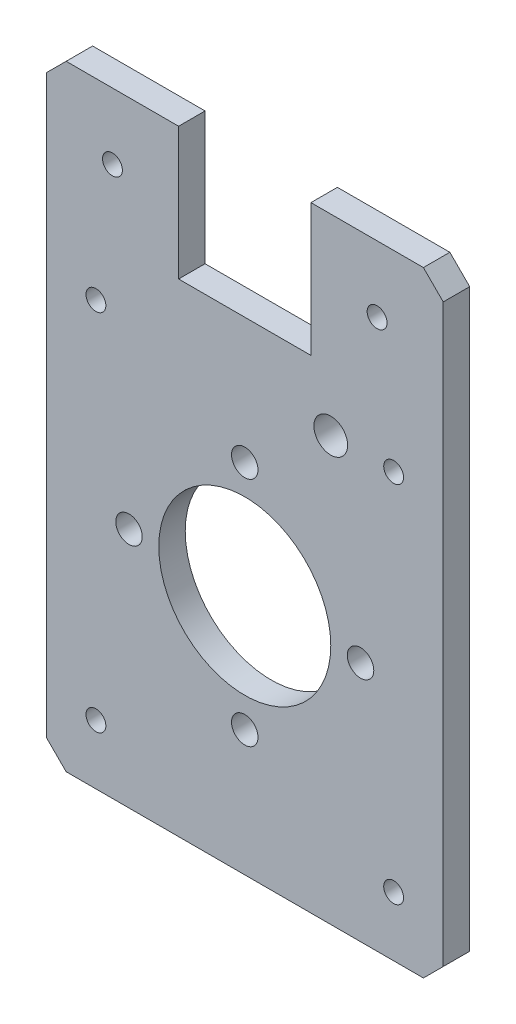
ISO-10303-21;
HEADER;
FILE_DESCRIPTION(('STEP AP214'),'2;1');
FILE_NAME('part.step','',(''),(''),'','','');
FILE_SCHEMA(('AUTOMOTIVE_DESIGN { 1 0 10303 214 1 1 1 1 }'));
ENDSEC;
DATA;
#1=APPLICATION_CONTEXT('core data for automotive mechanical design processes');
#2=APPLICATION_PROTOCOL_DEFINITION('international standard','automotive_design',2000,#1);
#3=PRODUCT_CONTEXT('',#1,'mechanical');
#4=PRODUCT('Part','Part','',(#3));
#5=PRODUCT_RELATED_PRODUCT_CATEGORY('part','',(#4));
#6=PRODUCT_DEFINITION_FORMATION('','',#4);
#7=PRODUCT_DEFINITION_CONTEXT('part definition',#1,'design');
#8=PRODUCT_DEFINITION('design','',#6,#7);
#9=PRODUCT_DEFINITION_SHAPE('','',#8);
#10=(LENGTH_UNIT() NAMED_UNIT(*) SI_UNIT(.MILLI.,.METRE.));
#11=(NAMED_UNIT(*) PLANE_ANGLE_UNIT() SI_UNIT($,.RADIAN.));
#12=(NAMED_UNIT(*) SI_UNIT($,.STERADIAN.) SOLID_ANGLE_UNIT());
#13=UNCERTAINTY_MEASURE_WITH_UNIT(LENGTH_MEASURE(1.E-05),#10,'distance_accuracy_value','');
#14=(GEOMETRIC_REPRESENTATION_CONTEXT(3) GLOBAL_UNCERTAINTY_ASSIGNED_CONTEXT((#13)) GLOBAL_UNIT_ASSIGNED_CONTEXT((#10,
#11,#12)) REPRESENTATION_CONTEXT('',''));
#15=CARTESIAN_POINT('',(0.,0.,0.));
#16=DIRECTION('',(0.,0.,1.));
#17=DIRECTION('',(1.,0.,0.));
#18=AXIS2_PLACEMENT_3D('',#15,#16,#17);
#19=CARTESIAN_POINT('',(0.,0.,6.));
#20=DIRECTION('',(1.,0.,0.));
#21=DIRECTION('',(0.,0.,-1.));
#22=AXIS2_PLACEMENT_3D('',#19,#20,#21);
#23=PLANE('',#22);
#24=DIRECTION('',(0.,-1.,0.));
#25=VECTOR('',#24,1.);
#26=CARTESIAN_POINT('',(0.,90.,4.));
#27=LINE('',#26,#25);
#28=CARTESIAN_POINT('',(0.,90.,4.));
#29=VERTEX_POINT('',#28);
#30=CARTESIAN_POINT('',(0.,3.00000000000003,4.));
#31=VERTEX_POINT('',#30);
#32=EDGE_CURVE('E173',#29,#31,#27,.T.);
#33=ORIENTED_EDGE('',*,*,#32,.F.);
#34=DIRECTION('',(0.,0.,-1.));
#35=VECTOR('',#34,1.);
#36=CARTESIAN_POINT('',(0.,90.,0.));
#37=LINE('',#36,#35);
#38=CARTESIAN_POINT('',(0.,90.,0.));
#39=VERTEX_POINT('',#38);
#40=EDGE_CURVE('E47',#29,#39,#37,.T.);
#41=ORIENTED_EDGE('',*,*,#40,.T.);
#42=DIRECTION('',(0.,-1.,0.));
#43=VECTOR('',#42,1.);
#44=CARTESIAN_POINT('',(0.,0.,0.));
#45=LINE('',#44,#43);
#46=CARTESIAN_POINT('',(0.,3.00000000000003,0.));
#47=VERTEX_POINT('',#46);
#48=EDGE_CURVE('E171',#39,#47,#45,.T.);
#49=ORIENTED_EDGE('',*,*,#48,.T.);
#50=DIRECTION('',(0.,0.,1.));
#51=VECTOR('',#50,1.);
#52=CARTESIAN_POINT('',(0.,3.00000000000003,6.));
#53=LINE('',#52,#51);
#54=EDGE_CURVE('E154',#47,#31,#53,.T.);
#55=ORIENTED_EDGE('',*,*,#54,.T.);
#56=EDGE_LOOP('',(#33,#41,#49,#55));
#57=FACE_BOUND('',#56,.T.);
#58=ADVANCED_FACE('F38',(#57),#23,.F.);
#59=CARTESIAN_POINT('',(0.,0.,6.));
#60=DIRECTION('',(0.,1.,0.));
#61=DIRECTION('',(0.,0.,1.));
#62=AXIS2_PLACEMENT_3D('',#59,#60,#61);
#63=PLANE('',#62);
#64=DIRECTION('',(1.,0.,0.));
#65=VECTOR('',#64,1.);
#66=CARTESIAN_POINT('',(3.00000000000002,0.,4.));
#67=LINE('',#66,#65);
#68=CARTESIAN_POINT('',(3.00000000000002,0.,4.));
#69=VERTEX_POINT('',#68);
#70=CARTESIAN_POINT('',(57.,0.,4.));
#71=VERTEX_POINT('',#70);
#72=EDGE_CURVE('E135',#69,#71,#67,.T.);
#73=ORIENTED_EDGE('',*,*,#72,.F.);
#74=DIRECTION('',(0.,0.,-1.));
#75=VECTOR('',#74,1.);
#76=CARTESIAN_POINT('',(3.00000000000002,0.,6.));
#77=LINE('',#76,#75);
#78=CARTESIAN_POINT('',(3.00000000000002,0.,0.));
#79=VERTEX_POINT('',#78);
#80=EDGE_CURVE('E200',#69,#79,#77,.T.);
#81=ORIENTED_EDGE('',*,*,#80,.T.);
#82=DIRECTION('',(1.,0.,0.));
#83=VECTOR('',#82,1.);
#84=CARTESIAN_POINT('',(0.,0.,0.));
#85=LINE('',#84,#83);
#86=CARTESIAN_POINT('',(57.,0.,0.));
#87=VERTEX_POINT('',#86);
#88=EDGE_CURVE('E183',#79,#87,#85,.T.);
#89=ORIENTED_EDGE('',*,*,#88,.T.);
#90=DIRECTION('',(0.,0.,1.));
#91=VECTOR('',#90,1.);
#92=CARTESIAN_POINT('',(57.,0.,6.));
#93=LINE('',#92,#91);
#94=EDGE_CURVE('E198',#87,#71,#93,.T.);
#95=ORIENTED_EDGE('',*,*,#94,.T.);
#96=EDGE_LOOP('',(#73,#81,#89,#95));
#97=FACE_BOUND('',#96,.T.);
#98=ADVANCED_FACE('F203',(#97),#63,.F.);
#99=CARTESIAN_POINT('',(60.,0.,6.));
#100=DIRECTION('',(-1.,0.,0.));
#101=DIRECTION('',(0.,-1.,0.));
#102=AXIS2_PLACEMENT_3D('',#99,#100,#101);
#103=PLANE('',#102);
#104=DIRECTION('',(0.,1.,0.));
#105=VECTOR('',#104,1.);
#106=CARTESIAN_POINT('',(60.,3.00000000000002,4.));
#107=LINE('',#106,#105);
#108=CARTESIAN_POINT('',(60.,3.00000000000002,4.));
#109=VERTEX_POINT('',#108);
#110=CARTESIAN_POINT('',(60.,90.,4.));
#111=VERTEX_POINT('',#110);
#112=EDGE_CURVE('E132',#109,#111,#107,.T.);
#113=ORIENTED_EDGE('',*,*,#112,.F.);
#114=DIRECTION('',(0.,0.,-1.));
#115=VECTOR('',#114,1.);
#116=CARTESIAN_POINT('',(60.,3.00000000000002,6.));
#117=LINE('',#116,#115);
#118=CARTESIAN_POINT('',(60.,3.00000000000002,0.));
#119=VERTEX_POINT('',#118);
#120=EDGE_CURVE('E145',#109,#119,#117,.T.);
#121=ORIENTED_EDGE('',*,*,#120,.T.);
#122=DIRECTION('',(0.,1.,0.));
#123=VECTOR('',#122,1.);
#124=CARTESIAN_POINT('',(60.,0.,0.));
#125=LINE('',#124,#123);
#126=CARTESIAN_POINT('',(60.,90.,0.));
#127=VERTEX_POINT('',#126);
#128=EDGE_CURVE('E187',#119,#127,#125,.T.);
#129=ORIENTED_EDGE('',*,*,#128,.T.);
#130=DIRECTION('',(0.,0.,1.));
#131=VECTOR('',#130,1.);
#132=CARTESIAN_POINT('',(60.,90.,6.));
#133=LINE('',#132,#131);
#134=EDGE_CURVE('E148',#127,#111,#133,.T.);
#135=ORIENTED_EDGE('',*,*,#134,.T.);
#136=EDGE_LOOP('',(#113,#121,#129,#135));
#137=FACE_BOUND('',#136,.T.);
#138=ADVANCED_FACE('F144',(#137),#103,.F.);
#139=CARTESIAN_POINT('',(0.,73.,6.));
#140=DIRECTION('',(0.,-1.,0.));
#141=DIRECTION('',(0.,0.,-1.));
#142=AXIS2_PLACEMENT_3D('',#139,#140,#141);
#143=PLANE('',#142);
#144=DIRECTION('',(-1.,0.,0.));
#145=VECTOR('',#144,1.);
#146=CARTESIAN_POINT('',(40.,73.,4.));
#147=LINE('',#146,#145);
#148=CARTESIAN_POINT('',(40.,73.,4.));
#149=VERTEX_POINT('',#148);
#150=CARTESIAN_POINT('',(20.,73.,4.));
#151=VERTEX_POINT('',#150);
#152=EDGE_CURVE('E354',#149,#151,#147,.T.);
#153=ORIENTED_EDGE('',*,*,#152,.F.);
#154=DIRECTION('',(0.,0.,-1.));
#155=VECTOR('',#154,1.);
#156=CARTESIAN_POINT('',(40.,73.,6.));
#157=LINE('',#156,#155);
#158=CARTESIAN_POINT('',(40.,73.,0.));
#159=VERTEX_POINT('',#158);
#160=EDGE_CURVE('E280',#149,#159,#157,.T.);
#161=ORIENTED_EDGE('',*,*,#160,.T.);
#162=DIRECTION('',(-1.,0.,0.));
#163=VECTOR('',#162,1.);
#164=CARTESIAN_POINT('',(0.,73.,0.));
#165=LINE('',#164,#163);
#166=CARTESIAN_POINT('',(20.,73.,0.));
#167=VERTEX_POINT('',#166);
#168=EDGE_CURVE('E195',#159,#167,#165,.T.);
#169=ORIENTED_EDGE('',*,*,#168,.T.);
#170=DIRECTION('',(0.,0.,-1.));
#171=VECTOR('',#170,1.);
#172=CARTESIAN_POINT('',(20.,73.,6.));
#173=LINE('',#172,#171);
#174=EDGE_CURVE('E272',#151,#167,#173,.T.);
#175=ORIENTED_EDGE('',*,*,#174,.F.);
#176=EDGE_LOOP('',(#153,#161,#169,#175));
#177=FACE_BOUND('',#176,.T.);
#178=ADVANCED_FACE('F310',(#177),#143,.F.);
#179=CARTESIAN_POINT('',(7.5,64.,6.));
#180=DIRECTION('',(0.,0.,-1.));
#181=DIRECTION('',(-1.,0.,0.));
#182=AXIS2_PLACEMENT_3D('',#179,#180,#181);
#183=CYLINDRICAL_SURFACE('',#182,1.5);
#184=CARTESIAN_POINT('',(7.5,64.,0.));
#185=DIRECTION('',(0.,0.,-1.));
#186=DIRECTION('',(-1.,0.,0.));
#187=AXIS2_PLACEMENT_3D('',#184,#185,#186);
#188=CIRCLE('',#187,1.5);
#189=CARTESIAN_POINT('',(6.,64.,0.));
#190=VERTEX_POINT('',#189);
#191=EDGE_CURVE('E184',#190,#190,#188,.T.);
#192=ORIENTED_EDGE('',*,*,#191,.T.);
#193=EDGE_LOOP('',(#192));
#194=FACE_BOUND('',#193,.T.);
#195=CARTESIAN_POINT('',(7.5,64.,4.));
#196=DIRECTION('',(0.,0.,1.));
#197=DIRECTION('',(1.,0.,0.));
#198=AXIS2_PLACEMENT_3D('',#195,#196,#197);
#199=CIRCLE('',#198,1.5);
#200=CARTESIAN_POINT('',(9.,64.,4.));
#201=VERTEX_POINT('',#200);
#202=EDGE_CURVE('E242',#201,#201,#199,.F.);
#203=ORIENTED_EDGE('',*,*,#202,.F.);
#204=EDGE_LOOP('',(#203));
#205=FACE_BOUND('',#204,.T.);
#206=ADVANCED_FACE('F306',(#194,#205),#183,.F.);
#207=CARTESIAN_POINT('',(52.5,9.,6.));
#208=DIRECTION('',(0.,0.,-1.));
#209=DIRECTION('',(-1.,0.,0.));
#210=AXIS2_PLACEMENT_3D('',#207,#208,#209);
#211=CYLINDRICAL_SURFACE('',#210,1.5);
#212=CARTESIAN_POINT('',(52.5,9.,0.));
#213=DIRECTION('',(0.,0.,-1.));
#214=DIRECTION('',(-1.,0.,0.));
#215=AXIS2_PLACEMENT_3D('',#212,#213,#214);
#216=CIRCLE('',#215,1.5);
#217=CARTESIAN_POINT('',(51.,9.,0.));
#218=VERTEX_POINT('',#217);
#219=EDGE_CURVE('E190',#218,#218,#216,.T.);
#220=ORIENTED_EDGE('',*,*,#219,.T.);
#221=EDGE_LOOP('',(#220));
#222=FACE_BOUND('',#221,.T.);
#223=CARTESIAN_POINT('',(52.5,9.,4.));
#224=DIRECTION('',(0.,0.,1.));
#225=DIRECTION('',(1.,0.,0.));
#226=AXIS2_PLACEMENT_3D('',#223,#224,#225);
#227=CIRCLE('',#226,1.5);
#228=CARTESIAN_POINT('',(54.,9.,4.));
#229=VERTEX_POINT('',#228);
#230=EDGE_CURVE('E239',#229,#229,#227,.F.);
#231=ORIENTED_EDGE('',*,*,#230,.F.);
#232=EDGE_LOOP('',(#231));
#233=FACE_BOUND('',#232,.T.);
#234=ADVANCED_FACE('F309',(#222,#233),#211,.F.);
#235=CARTESIAN_POINT('',(7.49999999999999,9.,6.));
#236=DIRECTION('',(0.,0.,-1.));
#237=DIRECTION('',(-1.,0.,0.));
#238=AXIS2_PLACEMENT_3D('',#235,#236,#237);
#239=CYLINDRICAL_SURFACE('',#238,1.5);
#240=CARTESIAN_POINT('',(7.49999999999999,9.,0.));
#241=DIRECTION('',(0.,0.,-1.));
#242=DIRECTION('',(-1.,0.,0.));
#243=AXIS2_PLACEMENT_3D('',#240,#241,#242);
#244=CIRCLE('',#243,1.5);
#245=CARTESIAN_POINT('',(5.99999999999999,9.,0.));
#246=VERTEX_POINT('',#245);
#247=EDGE_CURVE('E287',#246,#246,#244,.T.);
#248=ORIENTED_EDGE('',*,*,#247,.T.);
#249=EDGE_LOOP('',(#248));
#250=FACE_BOUND('',#249,.T.);
#251=CARTESIAN_POINT('',(7.49999999999999,9.,4.));
#252=DIRECTION('',(0.,0.,1.));
#253=DIRECTION('',(1.,0.,0.));
#254=AXIS2_PLACEMENT_3D('',#251,#252,#253);
#255=CIRCLE('',#254,1.5);
#256=CARTESIAN_POINT('',(8.99999999999999,9.,4.));
#257=VERTEX_POINT('',#256);
#258=EDGE_CURVE('E236',#257,#257,#255,.F.);
#259=ORIENTED_EDGE('',*,*,#258,.F.);
#260=EDGE_LOOP('',(#259));
#261=FACE_BOUND('',#260,.T.);
#262=ADVANCED_FACE('F388',(#250,#261),#239,.F.);
#263=CARTESIAN_POINT('',(52.5,64.,6.));
#264=DIRECTION('',(0.,0.,-1.));
#265=DIRECTION('',(-1.,0.,0.));
#266=AXIS2_PLACEMENT_3D('',#263,#264,#265);
#267=CYLINDRICAL_SURFACE('',#266,1.5);
#268=CARTESIAN_POINT('',(52.5,64.,0.));
#269=DIRECTION('',(0.,0.,-1.));
#270=DIRECTION('',(-1.,0.,0.));
#271=AXIS2_PLACEMENT_3D('',#268,#269,#270);
#272=CIRCLE('',#271,1.5);
#273=CARTESIAN_POINT('',(51.,64.,0.));
#274=VERTEX_POINT('',#273);
#275=EDGE_CURVE('E283',#274,#274,#272,.T.);
#276=ORIENTED_EDGE('',*,*,#275,.T.);
#277=EDGE_LOOP('',(#276));
#278=FACE_BOUND('',#277,.T.);
#279=CARTESIAN_POINT('',(52.5,64.,4.));
#280=DIRECTION('',(0.,0.,1.));
#281=DIRECTION('',(1.,0.,0.));
#282=AXIS2_PLACEMENT_3D('',#279,#280,#281);
#283=CIRCLE('',#282,1.5);
#284=CARTESIAN_POINT('',(54.,64.,4.));
#285=VERTEX_POINT('',#284);
#286=EDGE_CURVE('E233',#285,#285,#283,.F.);
#287=ORIENTED_EDGE('',*,*,#286,.F.);
#288=EDGE_LOOP('',(#287));
#289=FACE_BOUND('',#288,.T.);
#290=ADVANCED_FACE('F292',(#278,#289),#267,.F.);
#291=CARTESIAN_POINT('',(0.,93.,6.));
#292=DIRECTION('',(0.,1.,0.));
#293=DIRECTION('',(0.,0.,1.));
#294=AXIS2_PLACEMENT_3D('',#291,#292,#293);
#295=PLANE('',#294);
#296=DIRECTION('',(0.,0.,-1.));
#297=VECTOR('',#296,1.);
#298=CARTESIAN_POINT('',(40.,93.,6.));
#299=LINE('',#298,#297);
#300=CARTESIAN_POINT('',(40.,93.,4.));
#301=VERTEX_POINT('',#300);
#302=CARTESIAN_POINT('',(40.,93.,0.));
#303=VERTEX_POINT('',#302);
#304=EDGE_CURVE('E281',#301,#303,#299,.T.);
#305=ORIENTED_EDGE('',*,*,#304,.F.);
#306=DIRECTION('',(-1.,0.,0.));
#307=VECTOR('',#306,1.);
#308=CARTESIAN_POINT('',(57.,93.,4.));
#309=LINE('',#308,#307);
#310=CARTESIAN_POINT('',(57.,93.,4.));
#311=VERTEX_POINT('',#310);
#312=EDGE_CURVE('E350',#311,#301,#309,.T.);
#313=ORIENTED_EDGE('',*,*,#312,.F.);
#314=DIRECTION('',(0.,0.,-1.));
#315=VECTOR('',#314,1.);
#316=CARTESIAN_POINT('',(57.,93.,0.));
#317=LINE('',#316,#315);
#318=CARTESIAN_POINT('',(57.,93.,0.));
#319=VERTEX_POINT('',#318);
#320=EDGE_CURVE('E153',#311,#319,#317,.T.);
#321=ORIENTED_EDGE('',*,*,#320,.T.);
#322=DIRECTION('',(1.,0.,0.));
#323=VECTOR('',#322,1.);
#324=CARTESIAN_POINT('',(0.,93.,0.));
#325=LINE('',#324,#323);
#326=EDGE_CURVE('E274',#303,#319,#325,.T.);
#327=ORIENTED_EDGE('',*,*,#326,.F.);
#328=EDGE_LOOP('',(#305,#313,#321,#327));
#329=FACE_BOUND('',#328,.T.);
#330=ADVANCED_FACE('F349',(#329),#295,.T.);
#331=CARTESIAN_POINT('',(40.,0.,6.));
#332=DIRECTION('',(-1.,0.,0.));
#333=DIRECTION('',(0.,0.,1.));
#334=AXIS2_PLACEMENT_3D('',#331,#332,#333);
#335=PLANE('',#334);
#336=ORIENTED_EDGE('',*,*,#160,.F.);
#337=DIRECTION('',(0.,-1.,0.));
#338=VECTOR('',#337,1.);
#339=CARTESIAN_POINT('',(40.,93.,4.));
#340=LINE('',#339,#338);
#341=EDGE_CURVE('E352',#301,#149,#340,.T.);
#342=ORIENTED_EDGE('',*,*,#341,.F.);
#343=ORIENTED_EDGE('',*,*,#304,.T.);
#344=DIRECTION('',(0.,1.,0.));
#345=VECTOR('',#344,1.);
#346=CARTESIAN_POINT('',(40.,0.,0.));
#347=LINE('',#346,#345);
#348=EDGE_CURVE('E277',#159,#303,#347,.T.);
#349=ORIENTED_EDGE('',*,*,#348,.F.);
#350=EDGE_LOOP('',(#336,#342,#343,#349));
#351=FACE_BOUND('',#350,.T.);
#352=ADVANCED_FACE('F375',(#351),#335,.T.);
#353=CARTESIAN_POINT('',(0.,93.,6.));
#354=DIRECTION('',(0.,1.,0.));
#355=DIRECTION('',(0.,0.,1.));
#356=AXIS2_PLACEMENT_3D('',#353,#354,#355);
#357=PLANE('',#356);
#358=DIRECTION('',(0.,0.,1.));
#359=VECTOR('',#358,1.);
#360=CARTESIAN_POINT('',(3.00000000000002,93.,6.));
#361=LINE('',#360,#359);
#362=CARTESIAN_POINT('',(3.00000000000002,93.,0.));
#363=VERTEX_POINT('',#362);
#364=CARTESIAN_POINT('',(3.00000000000002,93.,4.));
#365=VERTEX_POINT('',#364);
#366=EDGE_CURVE('E11',#363,#365,#361,.T.);
#367=ORIENTED_EDGE('',*,*,#366,.T.);
#368=DIRECTION('',(-1.,0.,0.));
#369=VECTOR('',#368,1.);
#370=CARTESIAN_POINT('',(20.,93.,4.));
#371=LINE('',#370,#369);
#372=CARTESIAN_POINT('',(20.,93.,4.));
#373=VERTEX_POINT('',#372);
#374=EDGE_CURVE('E54',#373,#365,#371,.T.);
#375=ORIENTED_EDGE('',*,*,#374,.F.);
#376=DIRECTION('',(0.,0.,-1.));
#377=VECTOR('',#376,1.);
#378=CARTESIAN_POINT('',(20.,93.,6.));
#379=LINE('',#378,#377);
#380=CARTESIAN_POINT('',(20.,93.,0.));
#381=VERTEX_POINT('',#380);
#382=EDGE_CURVE('E271',#373,#381,#379,.T.);
#383=ORIENTED_EDGE('',*,*,#382,.T.);
#384=DIRECTION('',(1.,0.,0.));
#385=VECTOR('',#384,1.);
#386=CARTESIAN_POINT('',(0.,93.,0.));
#387=LINE('',#386,#385);
#388=EDGE_CURVE('E264',#363,#381,#387,.T.);
#389=ORIENTED_EDGE('',*,*,#388,.F.);
#390=EDGE_LOOP('',(#367,#375,#383,#389));
#391=FACE_BOUND('',#390,.T.);
#392=ADVANCED_FACE('F362',(#391),#357,.T.);
#393=CARTESIAN_POINT('',(20.,0.,6.));
#394=DIRECTION('',(1.,0.,0.));
#395=DIRECTION('',(0.,1.,0.));
#396=AXIS2_PLACEMENT_3D('',#393,#394,#395);
#397=PLANE('',#396);
#398=ORIENTED_EDGE('',*,*,#382,.F.);
#399=DIRECTION('',(0.,1.,0.));
#400=VECTOR('',#399,1.);
#401=CARTESIAN_POINT('',(20.,73.,4.));
#402=LINE('',#401,#400);
#403=EDGE_CURVE('E359',#151,#373,#402,.T.);
#404=ORIENTED_EDGE('',*,*,#403,.F.);
#405=ORIENTED_EDGE('',*,*,#174,.T.);
#406=DIRECTION('',(0.,-1.,0.));
#407=VECTOR('',#406,1.);
#408=CARTESIAN_POINT('',(20.,0.,0.));
#409=LINE('',#408,#407);
#410=EDGE_CURVE('E268',#381,#167,#409,.T.);
#411=ORIENTED_EDGE('',*,*,#410,.F.);
#412=EDGE_LOOP('',(#398,#404,#405,#411));
#413=FACE_BOUND('',#412,.T.);
#414=ADVANCED_FACE('F367',(#413),#397,.T.);
#415=CARTESIAN_POINT('',(50.,83.,10.));
#416=DIRECTION('',(0.,0.,-1.));
#417=DIRECTION('',(-1.,0.,0.));
#418=AXIS2_PLACEMENT_3D('',#415,#416,#417);
#419=CYLINDRICAL_SURFACE('',#418,1.5);
#420=CARTESIAN_POINT('',(50.,83.,0.));
#421=DIRECTION('',(0.,0.,-1.));
#422=DIRECTION('',(-1.,0.,0.));
#423=AXIS2_PLACEMENT_3D('',#420,#421,#422);
#424=CIRCLE('',#423,1.5);
#425=CARTESIAN_POINT('',(48.5,83.,0.));
#426=VERTEX_POINT('',#425);
#427=EDGE_CURVE('E260',#426,#426,#424,.T.);
#428=ORIENTED_EDGE('',*,*,#427,.T.);
#429=EDGE_LOOP('',(#428));
#430=FACE_BOUND('',#429,.T.);
#431=CARTESIAN_POINT('',(50.,83.,4.));
#432=DIRECTION('',(0.,0.,1.));
#433=DIRECTION('',(1.,0.,0.));
#434=AXIS2_PLACEMENT_3D('',#431,#432,#433);
#435=CIRCLE('',#434,1.5);
#436=CARTESIAN_POINT('',(51.5,83.,4.));
#437=VERTEX_POINT('',#436);
#438=EDGE_CURVE('E230',#437,#437,#435,.F.);
#439=ORIENTED_EDGE('',*,*,#438,.F.);
#440=EDGE_LOOP('',(#439));
#441=FACE_BOUND('',#440,.T.);
#442=ADVANCED_FACE('F444',(#430,#441),#419,.F.);
#443=CARTESIAN_POINT('',(10.,83.,10.));
#444=DIRECTION('',(0.,0.,-1.));
#445=DIRECTION('',(-1.,0.,0.));
#446=AXIS2_PLACEMENT_3D('',#443,#444,#445);
#447=CYLINDRICAL_SURFACE('',#446,1.5);
#448=CARTESIAN_POINT('',(10.,83.,0.));
#449=DIRECTION('',(0.,0.,-1.));
#450=DIRECTION('',(-1.,0.,0.));
#451=AXIS2_PLACEMENT_3D('',#448,#449,#450);
#452=CIRCLE('',#451,1.5);
#453=CARTESIAN_POINT('',(8.5,83.,0.));
#454=VERTEX_POINT('',#453);
#455=EDGE_CURVE('E261',#454,#454,#452,.T.);
#456=ORIENTED_EDGE('',*,*,#455,.T.);
#457=EDGE_LOOP('',(#456));
#458=FACE_BOUND('',#457,.T.);
#459=CARTESIAN_POINT('',(10.,83.,4.));
#460=DIRECTION('',(0.,0.,1.));
#461=DIRECTION('',(1.,0.,0.));
#462=AXIS2_PLACEMENT_3D('',#459,#460,#461);
#463=CIRCLE('',#462,1.5);
#464=CARTESIAN_POINT('',(11.5,83.,4.));
#465=VERTEX_POINT('',#464);
#466=EDGE_CURVE('E227',#465,#465,#463,.F.);
#467=ORIENTED_EDGE('',*,*,#466,.F.);
#468=EDGE_LOOP('',(#467));
#469=FACE_BOUND('',#468,.T.);
#470=ADVANCED_FACE('F335',(#458,#469),#447,.F.);
#471=CARTESIAN_POINT('',(3.00000000000002,0.,6.));
#472=DIRECTION('',(0.707106781186549,0.707106781186546,0.));
#473=DIRECTION('',(0.,0.,-1.));
#474=AXIS2_PLACEMENT_3D('',#471,#472,#473);
#475=PLANE('',#474);
#476=ORIENTED_EDGE('',*,*,#80,.F.);
#477=DIRECTION('',(0.707106781186546,-0.707106781186549,0.));
#478=VECTOR('',#477,1.);
#479=CARTESIAN_POINT('',(0.,3.00000000000003,4.));
#480=LINE('',#479,#478);
#481=EDGE_CURVE('E208',#31,#69,#480,.T.);
#482=ORIENTED_EDGE('',*,*,#481,.F.);
#483=ORIENTED_EDGE('',*,*,#54,.F.);
#484=DIRECTION('',(0.707106781186546,-0.707106781186549,0.));
#485=VECTOR('',#484,1.);
#486=CARTESIAN_POINT('',(1.50000000000002,1.50000000000001,0.));
#487=LINE('',#486,#485);
#488=EDGE_CURVE('E159',#79,#47,#487,.F.);
#489=ORIENTED_EDGE('',*,*,#488,.F.);
#490=EDGE_LOOP('',(#476,#482,#483,#489));
#491=FACE_BOUND('',#490,.T.);
#492=ADVANCED_FACE('F207',(#491),#475,.F.);
#493=CARTESIAN_POINT('',(60.,3.00000000000002,6.));
#494=DIRECTION('',(-0.707106781186546,0.707106781186549,0.));
#495=DIRECTION('',(0.,0.,-1.));
#496=AXIS2_PLACEMENT_3D('',#493,#494,#495);
#497=PLANE('',#496);
#498=ORIENTED_EDGE('',*,*,#120,.F.);
#499=DIRECTION('',(0.707106781186549,0.707106781186546,0.));
#500=VECTOR('',#499,1.);
#501=CARTESIAN_POINT('',(57.,0.,4.));
#502=LINE('',#501,#500);
#503=EDGE_CURVE('E128',#71,#109,#502,.T.);
#504=ORIENTED_EDGE('',*,*,#503,.F.);
#505=ORIENTED_EDGE('',*,*,#94,.F.);
#506=DIRECTION('',(0.707106781186549,0.707106781186546,0.));
#507=VECTOR('',#506,1.);
#508=CARTESIAN_POINT('',(28.4999999999998,-28.5,0.));
#509=LINE('',#508,#507);
#510=EDGE_CURVE('E152',#119,#87,#509,.F.);
#511=ORIENTED_EDGE('',*,*,#510,.F.);
#512=EDGE_LOOP('',(#498,#504,#505,#511));
#513=FACE_BOUND('',#512,.T.);
#514=ADVANCED_FACE('F151',(#513),#497,.F.);
#515=CARTESIAN_POINT('',(57.,93.,6.));
#516=DIRECTION('',(0.707106781186548,0.707106781186548,0.));
#517=DIRECTION('',(0.,0.,1.));
#518=AXIS2_PLACEMENT_3D('',#515,#516,#517);
#519=PLANE('',#518);
#520=ORIENTED_EDGE('',*,*,#320,.F.);
#521=DIRECTION('',(-0.707106781186548,0.707106781186548,0.));
#522=VECTOR('',#521,1.);
#523=CARTESIAN_POINT('',(60.,90.,4.));
#524=LINE('',#523,#522);
#525=EDGE_CURVE('E149',#111,#311,#524,.T.);
#526=ORIENTED_EDGE('',*,*,#525,.F.);
#527=ORIENTED_EDGE('',*,*,#134,.F.);
#528=DIRECTION('',(0.707106781186548,-0.707106781186548,0.));
#529=VECTOR('',#528,1.);
#530=CARTESIAN_POINT('',(75.,75.,0.));
#531=LINE('',#530,#529);
#532=EDGE_CURVE('E62',#319,#127,#531,.T.);
#533=ORIENTED_EDGE('',*,*,#532,.F.);
#534=EDGE_LOOP('',(#520,#526,#527,#533));
#535=FACE_BOUND('',#534,.T.);
#536=ADVANCED_FACE('F337',(#535),#519,.T.);
#537=CARTESIAN_POINT('',(0.,90.,6.));
#538=DIRECTION('',(-0.707106781186546,0.707106781186549,0.));
#539=DIRECTION('',(0.,0.,1.));
#540=AXIS2_PLACEMENT_3D('',#537,#538,#539);
#541=PLANE('',#540);
#542=ORIENTED_EDGE('',*,*,#40,.F.);
#543=DIRECTION('',(-0.707106781186549,-0.707106781186546,0.));
#544=VECTOR('',#543,1.);
#545=CARTESIAN_POINT('',(3.00000000000002,93.,4.));
#546=LINE('',#545,#544);
#547=EDGE_CURVE('E211',#365,#29,#546,.T.);
#548=ORIENTED_EDGE('',*,*,#547,.F.);
#549=ORIENTED_EDGE('',*,*,#366,.F.);
#550=DIRECTION('',(0.707106781186549,0.707106781186546,0.));
#551=VECTOR('',#550,1.);
#552=CARTESIAN_POINT('',(-45.,45.0000000000002,0.));
#553=LINE('',#552,#551);
#554=EDGE_CURVE('E156',#39,#363,#553,.T.);
#555=ORIENTED_EDGE('',*,*,#554,.F.);
#556=EDGE_LOOP('',(#542,#548,#549,#555));
#557=FACE_BOUND('',#556,.T.);
#558=ADVANCED_FACE('F40',(#557),#541,.T.);
#559=CARTESIAN_POINT('',(47.4999999999998,36.4999999999999,6.));
#560=DIRECTION('',(0.,0.,-1.));
#561=DIRECTION('',(-1.,0.,0.));
#562=AXIS2_PLACEMENT_3D('',#559,#560,#561);
#563=CYLINDRICAL_SURFACE('',#562,2.);
#564=CARTESIAN_POINT('',(47.4999999999998,36.4999999999999,0.));
#565=DIRECTION('',(0.,0.,-1.));
#566=DIRECTION('',(-1.,0.,0.));
#567=AXIS2_PLACEMENT_3D('',#564,#565,#566);
#568=CIRCLE('',#567,2.);
#569=CARTESIAN_POINT('',(45.4999999999998,36.4999999999999,0.));
#570=VERTEX_POINT('',#569);
#571=EDGE_CURVE('E251',#570,#570,#568,.F.);
#572=ORIENTED_EDGE('',*,*,#571,.F.);
#573=EDGE_LOOP('',(#572));
#574=FACE_BOUND('',#573,.T.);
#575=CARTESIAN_POINT('',(47.4999999999998,36.4999999999999,4.));
#576=DIRECTION('',(0.,0.,1.));
#577=DIRECTION('',(1.,0.,0.));
#578=AXIS2_PLACEMENT_3D('',#575,#576,#577);
#579=CIRCLE('',#578,2.);
#580=CARTESIAN_POINT('',(49.4999999999998,36.4999999999999,4.));
#581=VERTEX_POINT('',#580);
#582=EDGE_CURVE('E224',#581,#581,#579,.F.);
#583=ORIENTED_EDGE('',*,*,#582,.F.);
#584=EDGE_LOOP('',(#583));
#585=FACE_BOUND('',#584,.T.);
#586=ADVANCED_FACE('F343',(#574,#585),#563,.F.);
#587=CARTESIAN_POINT('',(29.9999999999996,19.,6.));
#588=DIRECTION('',(0.,0.,-1.));
#589=DIRECTION('',(-1.,0.,0.));
#590=AXIS2_PLACEMENT_3D('',#587,#588,#589);
#591=CYLINDRICAL_SURFACE('',#590,2.);
#592=CARTESIAN_POINT('',(29.9999999999996,19.,0.));
#593=DIRECTION('',(0.,0.,-1.));
#594=DIRECTION('',(-1.,0.,0.));
#595=AXIS2_PLACEMENT_3D('',#592,#593,#594);
#596=CIRCLE('',#595,2.);
#597=CARTESIAN_POINT('',(27.9999999999996,19.,0.));
#598=VERTEX_POINT('',#597);
#599=EDGE_CURVE('E248',#598,#598,#596,.F.);
#600=ORIENTED_EDGE('',*,*,#599,.F.);
#601=EDGE_LOOP('',(#600));
#602=FACE_BOUND('',#601,.T.);
#603=CARTESIAN_POINT('',(29.9999999999996,19.,4.));
#604=DIRECTION('',(0.,0.,1.));
#605=DIRECTION('',(1.,0.,0.));
#606=AXIS2_PLACEMENT_3D('',#603,#604,#605);
#607=CIRCLE('',#606,2.);
#608=CARTESIAN_POINT('',(31.9999999999996,19.,4.));
#609=VERTEX_POINT('',#608);
#610=EDGE_CURVE('E221',#609,#609,#607,.F.);
#611=ORIENTED_EDGE('',*,*,#610,.F.);
#612=EDGE_LOOP('',(#611));
#613=FACE_BOUND('',#612,.T.);
#614=ADVANCED_FACE('F492',(#602,#613),#591,.F.);
#615=CARTESIAN_POINT('',(12.4999999999997,36.5000000000002,6.));
#616=DIRECTION('',(0.,0.,-1.));
#617=DIRECTION('',(-1.,0.,0.));
#618=AXIS2_PLACEMENT_3D('',#615,#616,#617);
#619=CYLINDRICAL_SURFACE('',#618,2.00000000000001);
#620=CARTESIAN_POINT('',(12.4999999999997,36.5000000000002,0.));
#621=DIRECTION('',(0.,0.,-1.));
#622=DIRECTION('',(-1.,0.,0.));
#623=AXIS2_PLACEMENT_3D('',#620,#621,#622);
#624=CIRCLE('',#623,2.00000000000001);
#625=CARTESIAN_POINT('',(10.4999999999997,36.5000000000002,0.));
#626=VERTEX_POINT('',#625);
#627=EDGE_CURVE('E254',#626,#626,#624,.F.);
#628=ORIENTED_EDGE('',*,*,#627,.F.);
#629=EDGE_LOOP('',(#628));
#630=FACE_BOUND('',#629,.T.);
#631=CARTESIAN_POINT('',(12.4999999999997,36.5000000000002,4.));
#632=DIRECTION('',(0.,0.,1.));
#633=DIRECTION('',(1.,0.,0.));
#634=AXIS2_PLACEMENT_3D('',#631,#632,#633);
#635=CIRCLE('',#634,2.00000000000001);
#636=CARTESIAN_POINT('',(14.4999999999998,36.5000000000002,4.));
#637=VERTEX_POINT('',#636);
#638=EDGE_CURVE('E218',#637,#637,#635,.F.);
#639=ORIENTED_EDGE('',*,*,#638,.F.);
#640=EDGE_LOOP('',(#639));
#641=FACE_BOUND('',#640,.T.);
#642=ADVANCED_FACE('F503',(#630,#641),#619,.F.);
#643=CARTESIAN_POINT('',(30.,54.,6.));
#644=DIRECTION('',(0.,0.,-1.));
#645=DIRECTION('',(-1.,0.,0.));
#646=AXIS2_PLACEMENT_3D('',#643,#644,#645);
#647=CYLINDRICAL_SURFACE('',#646,2.);
#648=CARTESIAN_POINT('',(30.,54.,0.));
#649=DIRECTION('',(0.,0.,-1.));
#650=DIRECTION('',(-1.,0.,0.));
#651=AXIS2_PLACEMENT_3D('',#648,#649,#650);
#652=CIRCLE('',#651,2.);
#653=CARTESIAN_POINT('',(28.,54.,0.));
#654=VERTEX_POINT('',#653);
#655=EDGE_CURVE('E245',#654,#654,#652,.F.);
#656=ORIENTED_EDGE('',*,*,#655,.F.);
#657=EDGE_LOOP('',(#656));
#658=FACE_BOUND('',#657,.T.);
#659=CARTESIAN_POINT('',(30.,54.,4.));
#660=DIRECTION('',(0.,0.,1.));
#661=DIRECTION('',(1.,0.,0.));
#662=AXIS2_PLACEMENT_3D('',#659,#660,#661);
#663=CIRCLE('',#662,2.);
#664=CARTESIAN_POINT('',(32.,54.,4.));
#665=VERTEX_POINT('',#664);
#666=EDGE_CURVE('E215',#665,#665,#663,.F.);
#667=ORIENTED_EDGE('',*,*,#666,.F.);
#668=EDGE_LOOP('',(#667));
#669=FACE_BOUND('',#668,.T.);
#670=ADVANCED_FACE('F515',(#658,#669),#647,.F.);
#671=CARTESIAN_POINT('',(30.,36.5,6.));
#672=DIRECTION('',(0.,0.,-1.));
#673=DIRECTION('',(-1.,0.,0.));
#674=AXIS2_PLACEMENT_3D('',#671,#672,#673);
#675=CYLINDRICAL_SURFACE('',#674,13.);
#676=CARTESIAN_POINT('',(30.,36.5,0.));
#677=DIRECTION('',(0.,0.,-1.));
#678=DIRECTION('',(-1.,0.,0.));
#679=AXIS2_PLACEMENT_3D('',#676,#677,#678);
#680=CIRCLE('',#679,13.);
#681=CARTESIAN_POINT('',(17.,36.5,0.));
#682=VERTEX_POINT('',#681);
#683=EDGE_CURVE('E257',#682,#682,#680,.F.);
#684=ORIENTED_EDGE('',*,*,#683,.F.);
#685=EDGE_LOOP('',(#684));
#686=FACE_BOUND('',#685,.T.);
#687=CARTESIAN_POINT('',(30.,36.5,4.));
#688=DIRECTION('',(0.,0.,1.));
#689=DIRECTION('',(1.,0.,0.));
#690=AXIS2_PLACEMENT_3D('',#687,#688,#689);
#691=CIRCLE('',#690,13.);
#692=CARTESIAN_POINT('',(43.,36.5,4.));
#693=VERTEX_POINT('',#692);
#694=EDGE_CURVE('E42',#693,#693,#691,.F.);
#695=ORIENTED_EDGE('',*,*,#694,.F.);
#696=EDGE_LOOP('',(#695));
#697=FACE_BOUND('',#696,.T.);
#698=ADVANCED_FACE('F297',(#686,#697),#675,.F.);
#699=CARTESIAN_POINT('',(0.,0.,0.));
#700=DIRECTION('',(0.,0.,-1.));
#701=DIRECTION('',(-1.,0.,0.));
#702=AXIS2_PLACEMENT_3D('',#699,#700,#701);
#703=PLANE('',#702);
#704=CARTESIAN_POINT('',(43.,64.,0.));
#705=DIRECTION('',(0.,0.,-1.));
#706=DIRECTION('',(-1.,0.,0.));
#707=AXIS2_PLACEMENT_3D('',#704,#705,#706);
#708=CIRCLE('',#707,2.55);
#709=CARTESIAN_POINT('',(40.45,64.,0.));
#710=VERTEX_POINT('',#709);
#711=EDGE_CURVE('E140',#710,#710,#708,.T.);
#712=ORIENTED_EDGE('',*,*,#711,.F.);
#713=EDGE_LOOP('',(#712));
#714=FACE_BOUND('',#713,.T.);
#715=ORIENTED_EDGE('',*,*,#455,.F.);
#716=EDGE_LOOP('',(#715));
#717=FACE_BOUND('',#716,.T.);
#718=ORIENTED_EDGE('',*,*,#427,.F.);
#719=EDGE_LOOP('',(#718));
#720=FACE_BOUND('',#719,.T.);
#721=ORIENTED_EDGE('',*,*,#275,.F.);
#722=EDGE_LOOP('',(#721));
#723=FACE_BOUND('',#722,.T.);
#724=ORIENTED_EDGE('',*,*,#247,.F.);
#725=EDGE_LOOP('',(#724));
#726=FACE_BOUND('',#725,.T.);
#727=ORIENTED_EDGE('',*,*,#219,.F.);
#728=EDGE_LOOP('',(#727));
#729=FACE_BOUND('',#728,.T.);
#730=ORIENTED_EDGE('',*,*,#191,.F.);
#731=EDGE_LOOP('',(#730));
#732=FACE_BOUND('',#731,.T.);
#733=ORIENTED_EDGE('',*,*,#326,.T.);
#734=ORIENTED_EDGE('',*,*,#532,.T.);
#735=ORIENTED_EDGE('',*,*,#128,.F.);
#736=ORIENTED_EDGE('',*,*,#510,.T.);
#737=ORIENTED_EDGE('',*,*,#88,.F.);
#738=ORIENTED_EDGE('',*,*,#488,.T.);
#739=ORIENTED_EDGE('',*,*,#48,.F.);
#740=ORIENTED_EDGE('',*,*,#554,.T.);
#741=ORIENTED_EDGE('',*,*,#388,.T.);
#742=ORIENTED_EDGE('',*,*,#410,.T.);
#743=ORIENTED_EDGE('',*,*,#168,.F.);
#744=ORIENTED_EDGE('',*,*,#348,.T.);
#745=EDGE_LOOP('',(#733,#734,#735,#736,#737,#738,#739,#740,#741,#742,#743,#744));
#746=FACE_BOUND('',#745,.T.);
#747=ORIENTED_EDGE('',*,*,#655,.T.);
#748=EDGE_LOOP('',(#747));
#749=FACE_BOUND('',#748,.T.);
#750=ORIENTED_EDGE('',*,*,#599,.T.);
#751=EDGE_LOOP('',(#750));
#752=FACE_BOUND('',#751,.T.);
#753=ORIENTED_EDGE('',*,*,#571,.T.);
#754=EDGE_LOOP('',(#753));
#755=FACE_BOUND('',#754,.T.);
#756=ORIENTED_EDGE('',*,*,#627,.T.);
#757=EDGE_LOOP('',(#756));
#758=FACE_BOUND('',#757,.T.);
#759=ORIENTED_EDGE('',*,*,#683,.T.);
#760=EDGE_LOOP('',(#759));
#761=FACE_BOUND('',#760,.T.);
#762=ADVANCED_FACE('F178',(#714,#717,#720,#723,#726,#729,#732,#746,#749,#752,#755,#758,#761),
#703,.T.);
#763=CARTESIAN_POINT('',(0.,0.,4.));
#764=DIRECTION('',(0.,0.,1.));
#765=DIRECTION('',(1.,0.,0.));
#766=AXIS2_PLACEMENT_3D('',#763,#764,#765);
#767=PLANE('',#766);
#768=CARTESIAN_POINT('',(43.,64.,4.));
#769=DIRECTION('',(0.,0.,1.));
#770=DIRECTION('',(1.,0.,0.));
#771=AXIS2_PLACEMENT_3D('',#768,#769,#770);
#772=CIRCLE('',#771,2.55);
#773=CARTESIAN_POINT('',(45.55,64.,4.));
#774=VERTEX_POINT('',#773);
#775=EDGE_CURVE('E657',#774,#774,#772,.T.);
#776=ORIENTED_EDGE('',*,*,#775,.F.);
#777=EDGE_LOOP('',(#776));
#778=FACE_BOUND('',#777,.T.);
#779=ORIENTED_EDGE('',*,*,#503,.T.);
#780=ORIENTED_EDGE('',*,*,#112,.T.);
#781=ORIENTED_EDGE('',*,*,#525,.T.);
#782=ORIENTED_EDGE('',*,*,#312,.T.);
#783=ORIENTED_EDGE('',*,*,#341,.T.);
#784=ORIENTED_EDGE('',*,*,#152,.T.);
#785=ORIENTED_EDGE('',*,*,#403,.T.);
#786=ORIENTED_EDGE('',*,*,#374,.T.);
#787=ORIENTED_EDGE('',*,*,#547,.T.);
#788=ORIENTED_EDGE('',*,*,#32,.T.);
#789=ORIENTED_EDGE('',*,*,#481,.T.);
#790=ORIENTED_EDGE('',*,*,#72,.T.);
#791=EDGE_LOOP('',(#779,#780,#781,#782,#783,#784,#785,#786,#787,#788,#789,#790));
#792=FACE_BOUND('',#791,.T.);
#793=ORIENTED_EDGE('',*,*,#694,.T.);
#794=EDGE_LOOP('',(#793));
#795=FACE_BOUND('',#794,.T.);
#796=ORIENTED_EDGE('',*,*,#666,.T.);
#797=EDGE_LOOP('',(#796));
#798=FACE_BOUND('',#797,.T.);
#799=ORIENTED_EDGE('',*,*,#638,.T.);
#800=EDGE_LOOP('',(#799));
#801=FACE_BOUND('',#800,.T.);
#802=ORIENTED_EDGE('',*,*,#610,.T.);
#803=EDGE_LOOP('',(#802));
#804=FACE_BOUND('',#803,.T.);
#805=ORIENTED_EDGE('',*,*,#582,.T.);
#806=EDGE_LOOP('',(#805));
#807=FACE_BOUND('',#806,.T.);
#808=ORIENTED_EDGE('',*,*,#466,.T.);
#809=EDGE_LOOP('',(#808));
#810=FACE_BOUND('',#809,.T.);
#811=ORIENTED_EDGE('',*,*,#438,.T.);
#812=EDGE_LOOP('',(#811));
#813=FACE_BOUND('',#812,.T.);
#814=ORIENTED_EDGE('',*,*,#286,.T.);
#815=EDGE_LOOP('',(#814));
#816=FACE_BOUND('',#815,.T.);
#817=ORIENTED_EDGE('',*,*,#258,.T.);
#818=EDGE_LOOP('',(#817));
#819=FACE_BOUND('',#818,.T.);
#820=ORIENTED_EDGE('',*,*,#230,.T.);
#821=EDGE_LOOP('',(#820));
#822=FACE_BOUND('',#821,.T.);
#823=ORIENTED_EDGE('',*,*,#202,.T.);
#824=EDGE_LOOP('',(#823));
#825=FACE_BOUND('',#824,.T.);
#826=ADVANCED_FACE('F130',(#778,#792,#795,#798,#801,#804,#807,#810,#813,#816,#819,#822,#825),
#767,.T.);
#827=CARTESIAN_POINT('',(43.,64.,-6.));
#828=DIRECTION('',(0.,0.,1.));
#829=DIRECTION('',(1.,0.,0.));
#830=AXIS2_PLACEMENT_3D('',#827,#828,#829);
#831=CYLINDRICAL_SURFACE('',#830,2.55);
#832=ORIENTED_EDGE('',*,*,#711,.T.);
#833=EDGE_LOOP('',(#832));
#834=FACE_BOUND('',#833,.T.);
#835=ORIENTED_EDGE('',*,*,#775,.T.);
#836=EDGE_LOOP('',(#835));
#837=FACE_BOUND('',#836,.T.);
#838=ADVANCED_FACE('F315',(#834,#837),#831,.F.);
#839=CLOSED_SHELL('',(#58,#98,#138,#178,#206,#234,#262,#290,#330,#352,#392,#414,#442,#470,#492,
#514,#536,#558,#586,#614,#642,#670,#698,#762,#826,#838));
#840=MANIFOLD_SOLID_BREP('B2',#839);
#841=ADVANCED_BREP_SHAPE_REPRESENTATION('',(#18,#840),#14);
#842=SHAPE_DEFINITION_REPRESENTATION(#9,#841);
ENDSEC;
END-ISO-10303-21;
